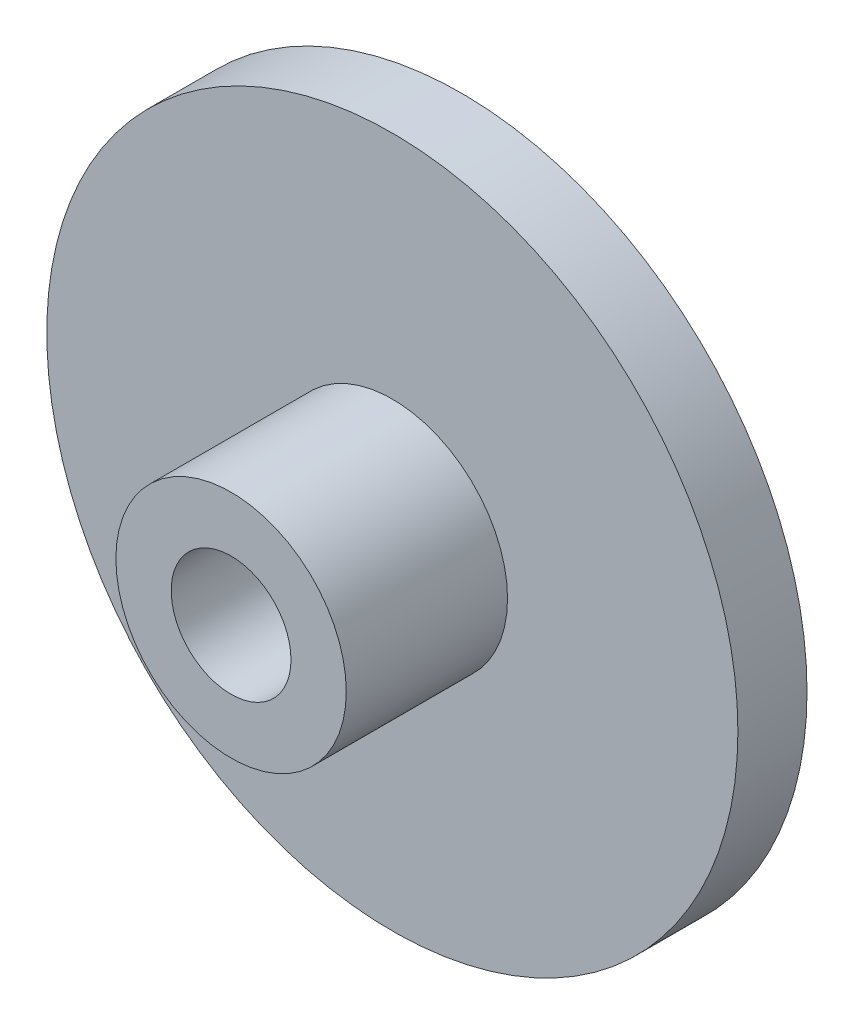
ISO-10303-21;
HEADER;
FILE_DESCRIPTION(('STEP AP214'),'2;1');
FILE_NAME('part.step','',(''),(''),'','','');
FILE_SCHEMA(('AUTOMOTIVE_DESIGN { 1 0 10303 214 1 1 1 1 }'));
ENDSEC;
DATA;
#1=APPLICATION_CONTEXT('core data for automotive mechanical design processes');
#2=APPLICATION_PROTOCOL_DEFINITION('international standard','automotive_design',2000,#1);
#3=PRODUCT_CONTEXT('',#1,'mechanical');
#4=PRODUCT('Part','Part','',(#3));
#5=PRODUCT_RELATED_PRODUCT_CATEGORY('part','',(#4));
#6=PRODUCT_DEFINITION_FORMATION('','',#4);
#7=PRODUCT_DEFINITION_CONTEXT('part definition',#1,'design');
#8=PRODUCT_DEFINITION('design','',#6,#7);
#9=PRODUCT_DEFINITION_SHAPE('','',#8);
#10=(LENGTH_UNIT() NAMED_UNIT(*) SI_UNIT(.MILLI.,.METRE.));
#11=(NAMED_UNIT(*) PLANE_ANGLE_UNIT() SI_UNIT($,.RADIAN.));
#12=(NAMED_UNIT(*) SI_UNIT($,.STERADIAN.) SOLID_ANGLE_UNIT());
#13=UNCERTAINTY_MEASURE_WITH_UNIT(LENGTH_MEASURE(1.E-05),#10,'distance_accuracy_value','');
#14=(GEOMETRIC_REPRESENTATION_CONTEXT(3) GLOBAL_UNCERTAINTY_ASSIGNED_CONTEXT((#13)) GLOBAL_UNIT_ASSIGNED_CONTEXT((#10,
#11,#12)) REPRESENTATION_CONTEXT('',''));
#15=CARTESIAN_POINT('',(0.,0.,0.));
#16=DIRECTION('',(0.,0.,1.));
#17=DIRECTION('',(1.,0.,0.));
#18=AXIS2_PLACEMENT_3D('',#15,#16,#17);
#19=CARTESIAN_POINT('',(0.,0.,3.));
#20=DIRECTION('',(0.,0.,-1.));
#21=DIRECTION('',(-1.,0.,0.));
#22=AXIS2_PLACEMENT_3D('',#19,#20,#21);
#23=CYLINDRICAL_SURFACE('',#22,15.);
#24=CARTESIAN_POINT('',(0.,0.,3.));
#25=DIRECTION('',(0.,0.,1.));
#26=DIRECTION('',(1.,0.,0.));
#27=AXIS2_PLACEMENT_3D('',#24,#25,#26);
#28=CIRCLE('',#27,15.);
#29=CARTESIAN_POINT('',(15.,0.,3.));
#30=VERTEX_POINT('',#29);
#31=EDGE_CURVE('E48',#30,#30,#28,.T.);
#32=ORIENTED_EDGE('',*,*,#31,.F.);
#33=EDGE_LOOP('',(#32));
#34=FACE_BOUND('',#33,.T.);
#35=CARTESIAN_POINT('',(0.,0.,0.));
#36=DIRECTION('',(0.,0.,1.));
#37=DIRECTION('',(1.,0.,0.));
#38=AXIS2_PLACEMENT_3D('',#35,#36,#37);
#39=CIRCLE('',#38,15.);
#40=CARTESIAN_POINT('',(15.,0.,0.));
#41=VERTEX_POINT('',#40);
#42=EDGE_CURVE('E53',#41,#41,#39,.T.);
#43=ORIENTED_EDGE('',*,*,#42,.T.);
#44=EDGE_LOOP('',(#43));
#45=FACE_BOUND('',#44,.T.);
#46=ADVANCED_FACE('F41',(#34,#45),#23,.T.);
#47=CARTESIAN_POINT('',(0.,0.,3.));
#48=DIRECTION('',(0.,0.,1.));
#49=DIRECTION('',(1.,0.,0.));
#50=AXIS2_PLACEMENT_3D('',#47,#48,#49);
#51=PLANE('',#50);
#52=CARTESIAN_POINT('',(0.,0.,3.));
#53=DIRECTION('',(0.,0.,1.));
#54=DIRECTION('',(1.,0.,0.));
#55=AXIS2_PLACEMENT_3D('',#52,#53,#54);
#56=CIRCLE('',#55,5.);
#57=CARTESIAN_POINT('',(5.,0.,3.));
#58=VERTEX_POINT('',#57);
#59=EDGE_CURVE('E61',#58,#58,#56,.T.);
#60=ORIENTED_EDGE('',*,*,#59,.F.);
#61=EDGE_LOOP('',(#60));
#62=FACE_BOUND('',#61,.T.);
#63=ORIENTED_EDGE('',*,*,#31,.T.);
#64=EDGE_LOOP('',(#63));
#65=FACE_BOUND('',#64,.T.);
#66=ADVANCED_FACE('F87',(#62,#65),#51,.T.);
#67=CARTESIAN_POINT('',(0.,0.,0.));
#68=DIRECTION('',(0.,0.,1.));
#69=DIRECTION('',(1.,0.,0.));
#70=AXIS2_PLACEMENT_3D('',#67,#68,#69);
#71=PLANE('',#70);
#72=ORIENTED_EDGE('',*,*,#42,.F.);
#73=EDGE_LOOP('',(#72));
#74=FACE_BOUND('',#73,.T.);
#75=ADVANCED_FACE('F78',(#74),#71,.F.);
#76=CARTESIAN_POINT('',(0.,0.,10.));
#77=DIRECTION('',(0.,0.,1.));
#78=DIRECTION('',(1.,0.,0.));
#79=AXIS2_PLACEMENT_3D('',#76,#77,#78);
#80=PLANE('',#79);
#81=CARTESIAN_POINT('',(0.,0.,10.));
#82=DIRECTION('',(0.,0.,1.));
#83=DIRECTION('',(1.,0.,0.));
#84=AXIS2_PLACEMENT_3D('',#81,#82,#83);
#85=CIRCLE('',#84,5.);
#86=CARTESIAN_POINT('',(5.,0.,10.));
#87=VERTEX_POINT('',#86);
#88=EDGE_CURVE('E59',#87,#87,#85,.T.);
#89=ORIENTED_EDGE('',*,*,#88,.T.);
#90=EDGE_LOOP('',(#89));
#91=FACE_BOUND('',#90,.T.);
#92=CARTESIAN_POINT('',(0.,0.,10.));
#93=DIRECTION('',(0.,0.,1.));
#94=DIRECTION('',(1.,0.,0.));
#95=AXIS2_PLACEMENT_3D('',#92,#93,#94);
#96=CIRCLE('',#95,2.6);
#97=CARTESIAN_POINT('',(2.6,0.,10.));
#98=VERTEX_POINT('',#97);
#99=EDGE_CURVE('E65',#98,#98,#96,.T.);
#100=ORIENTED_EDGE('',*,*,#99,.F.);
#101=EDGE_LOOP('',(#100));
#102=FACE_BOUND('',#101,.T.);
#103=ADVANCED_FACE('F75',(#91,#102),#80,.T.);
#104=CARTESIAN_POINT('',(0.,0.,10.));
#105=DIRECTION('',(0.,0.,-1.));
#106=DIRECTION('',(-1.,0.,0.));
#107=AXIS2_PLACEMENT_3D('',#104,#105,#106);
#108=CYLINDRICAL_SURFACE('',#107,5.);
#109=ORIENTED_EDGE('',*,*,#88,.F.);
#110=EDGE_LOOP('',(#109));
#111=FACE_BOUND('',#110,.T.);
#112=ORIENTED_EDGE('',*,*,#59,.T.);
#113=EDGE_LOOP('',(#112));
#114=FACE_BOUND('',#113,.T.);
#115=ADVANCED_FACE('F77',(#111,#114),#108,.T.);
#116=CARTESIAN_POINT('',(0.,0.,10.));
#117=DIRECTION('',(0.,0.,-1.));
#118=DIRECTION('',(-1.,0.,0.));
#119=AXIS2_PLACEMENT_3D('',#116,#117,#118);
#120=CYLINDRICAL_SURFACE('',#119,2.6);
#121=ORIENTED_EDGE('',*,*,#99,.T.);
#122=EDGE_LOOP('',(#121));
#123=FACE_BOUND('',#122,.T.);
#124=CARTESIAN_POINT('',(0.,0.,3.));
#125=DIRECTION('',(0.,0.,1.));
#126=DIRECTION('',(1.,0.,0.));
#127=AXIS2_PLACEMENT_3D('',#124,#125,#126);
#128=CIRCLE('',#127,2.6);
#129=CARTESIAN_POINT('',(2.6,0.,3.));
#130=VERTEX_POINT('',#129);
#131=EDGE_CURVE('E10',#130,#130,#128,.F.);
#132=ORIENTED_EDGE('',*,*,#131,.T.);
#133=EDGE_LOOP('',(#132));
#134=FACE_BOUND('',#133,.T.);
#135=ADVANCED_FACE('F73',(#123,#134),#120,.F.);
#136=ORIENTED_EDGE('',*,*,#131,.F.);
#137=EDGE_LOOP('',(#136));
#138=FACE_BOUND('',#137,.T.);
#139=ADVANCED_FACE('F97',(#138),#51,.T.);
#140=CLOSED_SHELL('',(#46,#66,#75,#103,#115,#135,#139));
#141=MANIFOLD_SOLID_BREP('B2',#140);
#142=ADVANCED_BREP_SHAPE_REPRESENTATION('',(#18,#141),#14);
#143=SHAPE_DEFINITION_REPRESENTATION(#9,#142);
ENDSEC;
END-ISO-10303-21;
